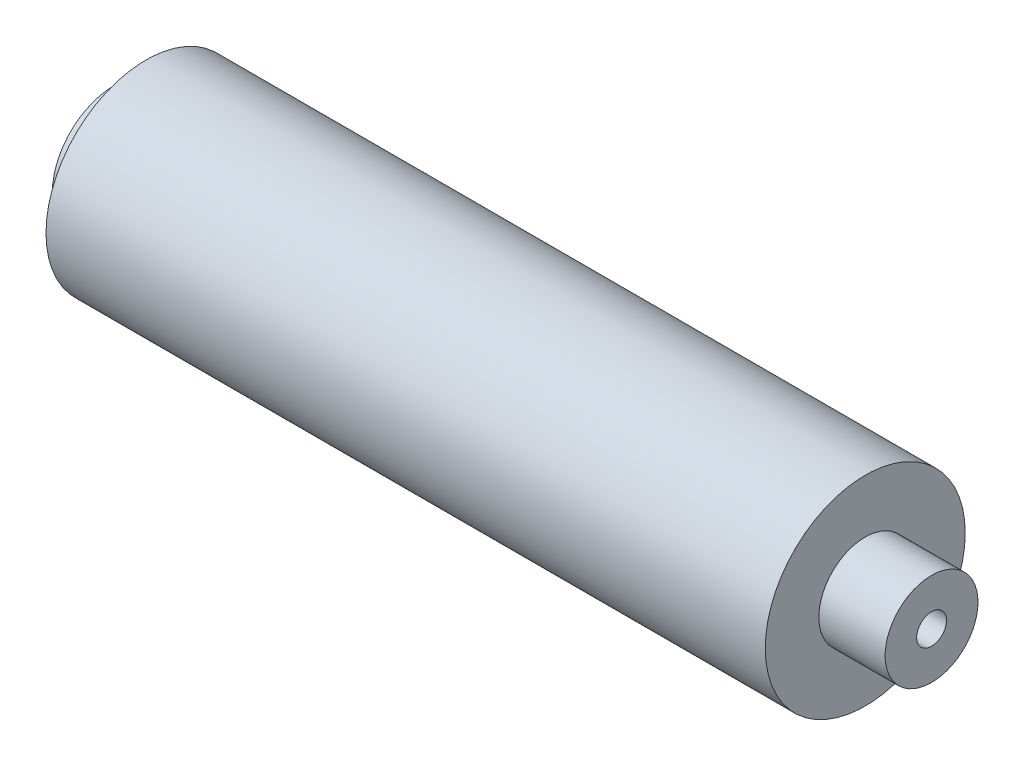
ISO-10303-21;
HEADER;
FILE_DESCRIPTION(('STEP AP214'),'2;1');
FILE_NAME('part.step','',(''),(''),'','','');
FILE_SCHEMA(('AUTOMOTIVE_DESIGN { 1 0 10303 214 1 1 1 1 }'));
ENDSEC;
DATA;
#1=APPLICATION_CONTEXT('core data for automotive mechanical design processes');
#2=APPLICATION_PROTOCOL_DEFINITION('international standard','automotive_design',2000,#1);
#3=PRODUCT_CONTEXT('',#1,'mechanical');
#4=PRODUCT('Part','Part','',(#3));
#5=PRODUCT_RELATED_PRODUCT_CATEGORY('part','',(#4));
#6=PRODUCT_DEFINITION_FORMATION('','',#4);
#7=PRODUCT_DEFINITION_CONTEXT('part definition',#1,'design');
#8=PRODUCT_DEFINITION('design','',#6,#7);
#9=PRODUCT_DEFINITION_SHAPE('','',#8);
#10=(LENGTH_UNIT() NAMED_UNIT(*) SI_UNIT(.MILLI.,.METRE.));
#11=(NAMED_UNIT(*) PLANE_ANGLE_UNIT() SI_UNIT($,.RADIAN.));
#12=(NAMED_UNIT(*) SI_UNIT($,.STERADIAN.) SOLID_ANGLE_UNIT());
#13=UNCERTAINTY_MEASURE_WITH_UNIT(LENGTH_MEASURE(1.E-05),#10,'distance_accuracy_value','');
#14=(GEOMETRIC_REPRESENTATION_CONTEXT(3) GLOBAL_UNCERTAINTY_ASSIGNED_CONTEXT((#13)) GLOBAL_UNIT_ASSIGNED_CONTEXT((#10,
#11,#12)) REPRESENTATION_CONTEXT('',''));
#15=CARTESIAN_POINT('',(0.,0.,0.));
#16=DIRECTION('',(0.,0.,1.));
#17=DIRECTION('',(1.,0.,0.));
#18=AXIS2_PLACEMENT_3D('',#15,#16,#17);
#19=CARTESIAN_POINT('',(118.4446395,0.,0.));
#20=DIRECTION('',(-1.,0.,0.));
#21=DIRECTION('',(0.,0.,1.));
#22=AXIS2_PLACEMENT_3D('',#19,#20,#21);
#23=CYLINDRICAL_SURFACE('',#22,15.07617);
#24=CARTESIAN_POINT('',(0.,0.,0.));
#25=DIRECTION('',(1.,0.,0.));
#26=DIRECTION('',(0.,0.,-1.));
#27=AXIS2_PLACEMENT_3D('',#24,#25,#26);
#28=CIRCLE('',#27,15.07617);
#29=CARTESIAN_POINT('',(0.,0.,15.07617));
#30=VERTEX_POINT('',#29);
#31=EDGE_CURVE('E86',#30,#30,#28,.T.);
#32=CARTESIAN_POINT('',(108.4446395,0.,0.));
#33=DIRECTION('',(1.,0.,0.));
#34=DIRECTION('',(0.,0.,-1.));
#35=AXIS2_PLACEMENT_3D('',#32,#33,#34);
#36=CIRCLE('',#35,15.07617);
#37=CARTESIAN_POINT('',(108.4446395,0.,15.07617));
#38=VERTEX_POINT('',#37);
#39=EDGE_CURVE('E66',#38,#38,#36,.T.);
#40=CARTESIAN_POINT('',(0.,0.,15.07617));
#41=CARTESIAN_POINT('',(1.12963166145834,0.,15.07617));
#42=CARTESIAN_POINT('',(2.25926332291667,0.,15.07617));
#43=CARTESIAN_POINT('',(4.51852664583333,0.,15.07617));
#44=CARTESIAN_POINT('',(5.64815830729167,0.,15.07617));
#45=CARTESIAN_POINT('',(7.90742163020834,0.,15.07617));
#46=CARTESIAN_POINT('',(9.03705329166667,0.,15.07617));
#47=CARTESIAN_POINT('',(11.2963166145833,0.,15.07617));
#48=CARTESIAN_POINT('',(12.4259482760417,0.,15.07617));
#49=CARTESIAN_POINT('',(14.6852115989583,0.,15.07617));
#50=CARTESIAN_POINT('',(15.8148432604167,0.,15.07617));
#51=CARTESIAN_POINT('',(18.0741065833333,0.,15.07617));
#52=CARTESIAN_POINT('',(19.2037382447917,0.,15.07617));
#53=CARTESIAN_POINT('',(21.4630015677083,0.,15.07617));
#54=CARTESIAN_POINT('',(22.5926332291667,0.,15.07617));
#55=CARTESIAN_POINT('',(24.8518965520833,0.,15.07617));
#56=CARTESIAN_POINT('',(25.9815282135417,0.,15.07617));
#57=CARTESIAN_POINT('',(28.2407915364583,0.,15.07617));
#58=CARTESIAN_POINT('',(29.3704231979167,0.,15.07617));
#59=CARTESIAN_POINT('',(31.6296865208333,0.,15.07617));
#60=CARTESIAN_POINT('',(32.7593181822917,0.,15.07617));
#61=CARTESIAN_POINT('',(35.0185815052083,0.,15.07617));
#62=CARTESIAN_POINT('',(36.1482131666667,0.,15.07617));
#63=CARTESIAN_POINT('',(38.4074764895833,0.,15.07617));
#64=CARTESIAN_POINT('',(39.5371081510417,0.,15.07617));
#65=CARTESIAN_POINT('',(41.7963714739583,0.,15.07617));
#66=CARTESIAN_POINT('',(42.9260031354167,0.,15.07617));
#67=CARTESIAN_POINT('',(45.1852664583333,0.,15.07617));
#68=CARTESIAN_POINT('',(46.3148981197917,0.,15.07617));
#69=CARTESIAN_POINT('',(48.5741614427083,0.,15.07617));
#70=CARTESIAN_POINT('',(49.7037931041667,0.,15.07617));
#71=CARTESIAN_POINT('',(51.9630564270833,0.,15.07617));
#72=CARTESIAN_POINT('',(53.0926880885417,0.,15.07617));
#73=CARTESIAN_POINT('',(55.3519514114583,0.,15.07617));
#74=CARTESIAN_POINT('',(56.4815830729167,0.,15.07617));
#75=CARTESIAN_POINT('',(58.7408463958333,0.,15.07617));
#76=CARTESIAN_POINT('',(59.8704780572917,0.,15.07617));
#77=CARTESIAN_POINT('',(62.1297413802083,0.,15.07617));
#78=CARTESIAN_POINT('',(63.2593730416667,0.,15.07617));
#79=CARTESIAN_POINT('',(65.5186363645833,0.,15.07617));
#80=CARTESIAN_POINT('',(66.6482680260417,0.,15.07617));
#81=CARTESIAN_POINT('',(68.9075313489583,0.,15.07617));
#82=CARTESIAN_POINT('',(70.0371630104166,0.,15.07617));
#83=CARTESIAN_POINT('',(72.2964263333333,0.,15.07617));
#84=CARTESIAN_POINT('',(73.4260579947916,0.,15.07617));
#85=CARTESIAN_POINT('',(75.6853213177083,0.,15.07617));
#86=CARTESIAN_POINT('',(76.8149529791666,0.,15.07617));
#87=CARTESIAN_POINT('',(79.0742163020833,0.,15.07617));
#88=CARTESIAN_POINT('',(80.2038479635416,0.,15.07617));
#89=CARTESIAN_POINT('',(82.4631112864583,0.,15.07617));
#90=CARTESIAN_POINT('',(83.5927429479166,0.,15.07617));
#91=CARTESIAN_POINT('',(85.8520062708333,0.,15.07617));
#92=CARTESIAN_POINT('',(86.9816379322916,0.,15.07617));
#93=CARTESIAN_POINT('',(89.2409012552083,0.,15.07617));
#94=CARTESIAN_POINT('',(90.3705329166666,0.,15.07617));
#95=CARTESIAN_POINT('',(92.6297962395833,0.,15.07617));
#96=CARTESIAN_POINT('',(93.7594279010416,0.,15.07617));
#97=CARTESIAN_POINT('',(96.0186912239583,0.,15.07617));
#98=CARTESIAN_POINT('',(97.1483228854166,0.,15.07617));
#99=CARTESIAN_POINT('',(99.4075862083333,0.,15.07617));
#100=CARTESIAN_POINT('',(100.537217869792,0.,15.07617));
#101=CARTESIAN_POINT('',(102.796481192708,0.,15.07617));
#102=CARTESIAN_POINT('',(103.926112854167,0.,15.07617));
#103=CARTESIAN_POINT('',(106.185376177083,0.,15.07617));
#104=CARTESIAN_POINT('',(107.315007838542,0.,15.07617));
#105=CARTESIAN_POINT('',(108.4446395,0.,15.07617));
#106=B_SPLINE_CURVE_WITH_KNOTS('',3,(#40,#41,#42,#43,#44,#45,#46,#47,#48,#49,#50,#51,#52,#53,
#54,#55,#56,#57,#58,#59,#60,#61,#62,#63,#64,#65,#66,#67,#68,#69,#70,#71,#72,#73,#74,#75,#76,#77,
#78,#79,#80,#81,#82,#83,#84,#85,#86,#87,#88,#89,#90,#91,#92,#93,#94,#95,#96,#97,#98,#99,#100,
#101,#102,#103,#104,#105),.UNSPECIFIED.,.F.,.F.,(4,2,2,2,2,2,2,2,2,2,2,2,2,2,2,2,2,2,2,2,2,2,2,
2,2,2,2,2,2,2,2,2,4),(0.,3.388894984375,6.77778996875,10.166684953125,13.5555799375,
16.944474921875,20.33336990625,23.722264890625,27.111159875,30.500054859375,33.88894984375,
37.277844828125,40.6667398125,44.055634796875,47.44452978125,50.833424765625,54.22231975,
57.611214734375,61.00010971875,64.389004703125,67.7778996875,71.166794671875,74.55568965625,
77.944584640625,81.333479625,84.722374609375,88.11126959375,91.500164578125,94.8890595625,
98.277954546875,101.66684953125,105.055744515625,108.4446395),.UNSPECIFIED.);
#107=EDGE_CURVE('BSEAM34',#30,#38,#106,.T.);
#108=ORIENTED_EDGE('',*,*,#31,.T.);
#109=ORIENTED_EDGE('',*,*,#39,.F.);
#110=ORIENTED_EDGE('',*,*,#107,.T.);
#111=ORIENTED_EDGE('',*,*,#107,.F.);
#112=EDGE_LOOP('',(#108,#110,#109,#111));
#113=FACE_BOUND('',#112,.T.);
#114=ADVANCED_FACE('F34',(#113),#23,.T.);
#115=CARTESIAN_POINT('',(0.,0.,0.));
#116=DIRECTION('',(1.,0.,0.));
#117=DIRECTION('',(0.,0.,-1.));
#118=AXIS2_PLACEMENT_3D('',#115,#116,#117);
#119=PLANE('',#118);
#120=CARTESIAN_POINT('',(0.,0.,0.));
#121=DIRECTION('',(1.,0.,0.));
#122=DIRECTION('',(0.,0.,-1.));
#123=AXIS2_PLACEMENT_3D('',#120,#121,#122);
#124=CIRCLE('',#123,9.3853);
#125=CARTESIAN_POINT('',(0.,0.,-9.3853));
#126=VERTEX_POINT('',#125);
#127=EDGE_CURVE('E41',#126,#126,#124,.F.);
#128=ORIENTED_EDGE('',*,*,#127,.F.);
#129=EDGE_LOOP('',(#128));
#130=FACE_BOUND('',#129,.T.);
#131=ORIENTED_EDGE('',*,*,#31,.F.);
#132=EDGE_LOOP('',(#131));
#133=FACE_BOUND('',#132,.T.);
#134=ADVANCED_FACE('F93',(#130,#133),#119,.F.);
#135=CARTESIAN_POINT('',(-4.7498,0.,0.));
#136=DIRECTION('',(-1.,0.,0.));
#137=DIRECTION('',(0.,0.,1.));
#138=AXIS2_PLACEMENT_3D('',#135,#136,#137);
#139=PLANE('',#138);
#140=CARTESIAN_POINT('',(-4.7498,0.,0.));
#141=DIRECTION('',(-1.,0.,0.));
#142=DIRECTION('',(0.,0.,1.));
#143=AXIS2_PLACEMENT_3D('',#140,#141,#142);
#144=CIRCLE('',#143,9.3853);
#145=CARTESIAN_POINT('',(-4.7498,0.,9.3853));
#146=VERTEX_POINT('',#145);
#147=EDGE_CURVE('E81',#146,#146,#144,.T.);
#148=ORIENTED_EDGE('',*,*,#147,.T.);
#149=EDGE_LOOP('',(#148));
#150=FACE_BOUND('',#149,.T.);
#151=CARTESIAN_POINT('',(-4.7498,0.,0.));
#152=DIRECTION('',(-1.,0.,0.));
#153=DIRECTION('',(0.,0.,1.));
#154=AXIS2_PLACEMENT_3D('',#151,#152,#153);
#155=CIRCLE('',#154,4.5847);
#156=CARTESIAN_POINT('',(-4.7498,0.,4.5847));
#157=VERTEX_POINT('',#156);
#158=EDGE_CURVE('E78',#157,#157,#155,.T.);
#159=ORIENTED_EDGE('',*,*,#158,.F.);
#160=EDGE_LOOP('',(#159));
#161=FACE_BOUND('',#160,.T.);
#162=ADVANCED_FACE('F96',(#150,#161),#139,.T.);
#163=CARTESIAN_POINT('',(-4.7498,0.,0.));
#164=DIRECTION('',(1.,0.,0.));
#165=DIRECTION('',(0.,0.,-1.));
#166=AXIS2_PLACEMENT_3D('',#163,#164,#165);
#167=CYLINDRICAL_SURFACE('',#166,9.3853);
#168=ORIENTED_EDGE('',*,*,#147,.F.);
#169=EDGE_LOOP('',(#168));
#170=FACE_BOUND('',#169,.T.);
#171=ORIENTED_EDGE('',*,*,#127,.T.);
#172=EDGE_LOOP('',(#171));
#173=FACE_BOUND('',#172,.T.);
#174=ADVANCED_FACE('F91',(#170,#173),#167,.T.);
#175=CARTESIAN_POINT('',(-4.7498,0.,0.));
#176=DIRECTION('',(1.,0.,0.));
#177=DIRECTION('',(0.,0.,-1.));
#178=AXIS2_PLACEMENT_3D('',#175,#176,#177);
#179=CYLINDRICAL_SURFACE('',#178,4.5847);
#180=ORIENTED_EDGE('',*,*,#158,.T.);
#181=EDGE_LOOP('',(#180));
#182=FACE_BOUND('',#181,.T.);
#183=CARTESIAN_POINT('',(0.,0.,0.));
#184=DIRECTION('',(-1.,0.,0.));
#185=DIRECTION('',(0.,0.,1.));
#186=AXIS2_PLACEMENT_3D('',#183,#184,#185);
#187=CIRCLE('',#186,4.5847);
#188=CARTESIAN_POINT('',(0.,0.,4.5847));
#189=VERTEX_POINT('',#188);
#190=EDGE_CURVE('E72',#189,#189,#187,.T.);
#191=ORIENTED_EDGE('',*,*,#190,.F.);
#192=EDGE_LOOP('',(#191));
#193=FACE_BOUND('',#192,.T.);
#194=ADVANCED_FACE('F144',(#182,#193),#179,.F.);
#195=ORIENTED_EDGE('',*,*,#190,.T.);
#196=EDGE_LOOP('',(#195));
#197=FACE_BOUND('',#196,.T.);
#198=ADVANCED_FACE('F97',(#197),#119,.F.);
#199=CARTESIAN_POINT('',(108.4446395,0.,0.));
#200=DIRECTION('',(1.,0.,0.));
#201=DIRECTION('',(0.,0.,-1.));
#202=AXIS2_PLACEMENT_3D('',#199,#200,#201);
#203=PLANE('',#202);
#204=CARTESIAN_POINT('',(108.4446395,0.,0.));
#205=DIRECTION('',(1.,0.,0.));
#206=DIRECTION('',(0.,0.,-1.));
#207=AXIS2_PLACEMENT_3D('',#204,#205,#206);
#208=CIRCLE('',#207,7.);
#209=CARTESIAN_POINT('',(108.4446395,0.,-7.));
#210=VERTEX_POINT('',#209);
#211=EDGE_CURVE('E105',#210,#210,#208,.T.);
#212=ORIENTED_EDGE('',*,*,#211,.F.);
#213=EDGE_LOOP('',(#212));
#214=FACE_BOUND('',#213,.T.);
#215=ORIENTED_EDGE('',*,*,#39,.T.);
#216=EDGE_LOOP('',(#215));
#217=FACE_BOUND('',#216,.T.);
#218=ADVANCED_FACE('F126',(#214,#217),#203,.T.);
#219=CARTESIAN_POINT('',(108.4446395,0.,0.));
#220=DIRECTION('',(1.,0.,0.));
#221=DIRECTION('',(0.,0.,-1.));
#222=AXIS2_PLACEMENT_3D('',#219,#220,#221);
#223=CYLINDRICAL_SURFACE('',#222,7.);
#224=ORIENTED_EDGE('',*,*,#211,.T.);
#225=EDGE_LOOP('',(#224));
#226=FACE_BOUND('',#225,.T.);
#227=CARTESIAN_POINT('',(118.4446395,0.,0.));
#228=DIRECTION('',(1.,0.,0.));
#229=DIRECTION('',(0.,0.,-1.));
#230=AXIS2_PLACEMENT_3D('',#227,#228,#229);
#231=CIRCLE('',#230,7.);
#232=CARTESIAN_POINT('',(118.4446395,0.,-7.));
#233=VERTEX_POINT('',#232);
#234=EDGE_CURVE('E108',#233,#233,#231,.T.);
#235=ORIENTED_EDGE('',*,*,#234,.F.);
#236=EDGE_LOOP('',(#235));
#237=FACE_BOUND('',#236,.T.);
#238=ADVANCED_FACE('F123',(#226,#237),#223,.T.);
#239=CARTESIAN_POINT('',(92.4446395,0.,0.));
#240=DIRECTION('',(1.,0.,0.));
#241=DIRECTION('',(0.,0.,-1.));
#242=AXIS2_PLACEMENT_3D('',#239,#240,#241);
#243=PLANE('',#242);
#244=CARTESIAN_POINT('',(92.4446395,0.,0.));
#245=DIRECTION('',(1.,0.,0.));
#246=DIRECTION('',(0.,0.,-1.));
#247=AXIS2_PLACEMENT_3D('',#244,#245,#246);
#248=CIRCLE('',#247,2.25);
#249=CARTESIAN_POINT('',(92.4446395,1.25,1.87082869338697));
#250=VERTEX_POINT('',#249);
#251=CARTESIAN_POINT('',(92.4446395,1.25,-1.87082869338697));
#252=VERTEX_POINT('',#251);
#253=EDGE_CURVE('E74',#250,#252,#248,.T.);
#254=ORIENTED_EDGE('',*,*,#253,.T.);
#255=DIRECTION('',(0.,0.,1.));
#256=VECTOR('',#255,1.);
#257=CARTESIAN_POINT('',(92.4446395,1.25,1.87082869338697));
#258=LINE('',#257,#256);
#259=EDGE_CURVE('E70',#252,#250,#258,.T.);
#260=ORIENTED_EDGE('',*,*,#259,.T.);
#261=EDGE_LOOP('',(#254,#260));
#262=FACE_BOUND('',#261,.T.);
#263=ADVANCED_FACE('F125',(#262),#243,.T.);
#264=CARTESIAN_POINT('',(92.4446395,1.25,1.87082869338697));
#265=DIRECTION('',(0.,1.,0.));
#266=DIRECTION('',(0.,0.,1.));
#267=AXIS2_PLACEMENT_3D('',#264,#265,#266);
#268=PLANE('',#267);
#269=DIRECTION('',(0.,0.,-1.));
#270=VECTOR('',#269,1.);
#271=CARTESIAN_POINT('',(115.8446395,1.25,1.87082869338697));
#272=LINE('',#271,#270);
#273=CARTESIAN_POINT('',(115.8446395,1.25,1.87082869338697));
#274=VERTEX_POINT('',#273);
#275=CARTESIAN_POINT('',(115.8446395,1.25,-1.87082869338697));
#276=VERTEX_POINT('',#275);
#277=EDGE_CURVE('E11',#274,#276,#272,.T.);
#278=ORIENTED_EDGE('',*,*,#277,.F.);
#279=DIRECTION('',(1.,0.,0.));
#280=VECTOR('',#279,1.);
#281=CARTESIAN_POINT('',(92.4446395,1.25,1.87082869338697));
#282=LINE('',#281,#280);
#283=EDGE_CURVE('E53',#250,#274,#282,.T.);
#284=ORIENTED_EDGE('',*,*,#283,.F.);
#285=ORIENTED_EDGE('',*,*,#259,.F.);
#286=DIRECTION('',(1.,0.,0.));
#287=VECTOR('',#286,1.);
#288=CARTESIAN_POINT('',(92.4446395,1.25,-1.87082869338697));
#289=LINE('',#288,#287);
#290=EDGE_CURVE('E63',#252,#276,#289,.T.);
#291=ORIENTED_EDGE('',*,*,#290,.T.);
#292=EDGE_LOOP('',(#278,#284,#285,#291));
#293=FACE_BOUND('',#292,.T.);
#294=ADVANCED_FACE('F68',(#293),#268,.F.);
#295=CARTESIAN_POINT('',(115.8446395,0.,0.));
#296=DIRECTION('',(1.,0.,0.));
#297=DIRECTION('',(0.,0.,-1.));
#298=AXIS2_PLACEMENT_3D('',#295,#296,#297);
#299=PLANE('',#298);
#300=ORIENTED_EDGE('',*,*,#277,.T.);
#301=CARTESIAN_POINT('',(115.8446395,0.,0.));
#302=DIRECTION('',(1.,0.,0.));
#303=DIRECTION('',(0.,0.,-1.));
#304=AXIS2_PLACEMENT_3D('',#301,#302,#303);
#305=CIRCLE('',#304,2.25);
#306=EDGE_CURVE('E46',#276,#274,#305,.T.);
#307=ORIENTED_EDGE('',*,*,#306,.T.);
#308=EDGE_LOOP('',(#300,#307));
#309=FACE_BOUND('',#308,.T.);
#310=ADVANCED_FACE('F59',(#309),#299,.T.);
#311=CARTESIAN_POINT('',(92.4446395,0.,0.));
#312=DIRECTION('',(1.,0.,0.));
#313=DIRECTION('',(0.,0.,-1.));
#314=AXIS2_PLACEMENT_3D('',#311,#312,#313);
#315=CYLINDRICAL_SURFACE('',#314,2.25);
#316=CARTESIAN_POINT('',(118.4446395,0.,0.));
#317=DIRECTION('',(1.,0.,0.));
#318=DIRECTION('',(0.,0.,-1.));
#319=AXIS2_PLACEMENT_3D('',#316,#317,#318);
#320=CIRCLE('',#319,2.25);
#321=CARTESIAN_POINT('',(118.4446395,0.,-2.25));
#322=VERTEX_POINT('',#321);
#323=EDGE_CURVE('E65',#322,#322,#320,.T.);
#324=ORIENTED_EDGE('',*,*,#323,.T.);
#325=EDGE_LOOP('',(#324));
#326=FACE_BOUND('',#325,.T.);
#327=ORIENTED_EDGE('',*,*,#306,.F.);
#328=ORIENTED_EDGE('',*,*,#290,.F.);
#329=ORIENTED_EDGE('',*,*,#253,.F.);
#330=ORIENTED_EDGE('',*,*,#283,.T.);
#331=EDGE_LOOP('',(#327,#328,#329,#330));
#332=FACE_BOUND('',#331,.T.);
#333=ADVANCED_FACE('F62',(#326,#332),#315,.F.);
#334=CARTESIAN_POINT('',(118.4446395,0.,0.));
#335=DIRECTION('',(1.,0.,0.));
#336=DIRECTION('',(0.,0.,-1.));
#337=AXIS2_PLACEMENT_3D('',#334,#335,#336);
#338=PLANE('',#337);
#339=ORIENTED_EDGE('',*,*,#323,.F.);
#340=EDGE_LOOP('',(#339));
#341=FACE_BOUND('',#340,.T.);
#342=ORIENTED_EDGE('',*,*,#234,.T.);
#343=EDGE_LOOP('',(#342));
#344=FACE_BOUND('',#343,.T.);
#345=ADVANCED_FACE('F116',(#341,#344),#338,.T.);
#346=CLOSED_SHELL('',(#114,#134,#162,#174,#194,#198,#218,#238,#263,#294,#310,#333,#345));
#347=MANIFOLD_SOLID_BREP('B2',#346);
#348=ADVANCED_BREP_SHAPE_REPRESENTATION('',(#18,#347),#14);
#349=SHAPE_DEFINITION_REPRESENTATION(#9,#348);
ENDSEC;
END-ISO-10303-21;
